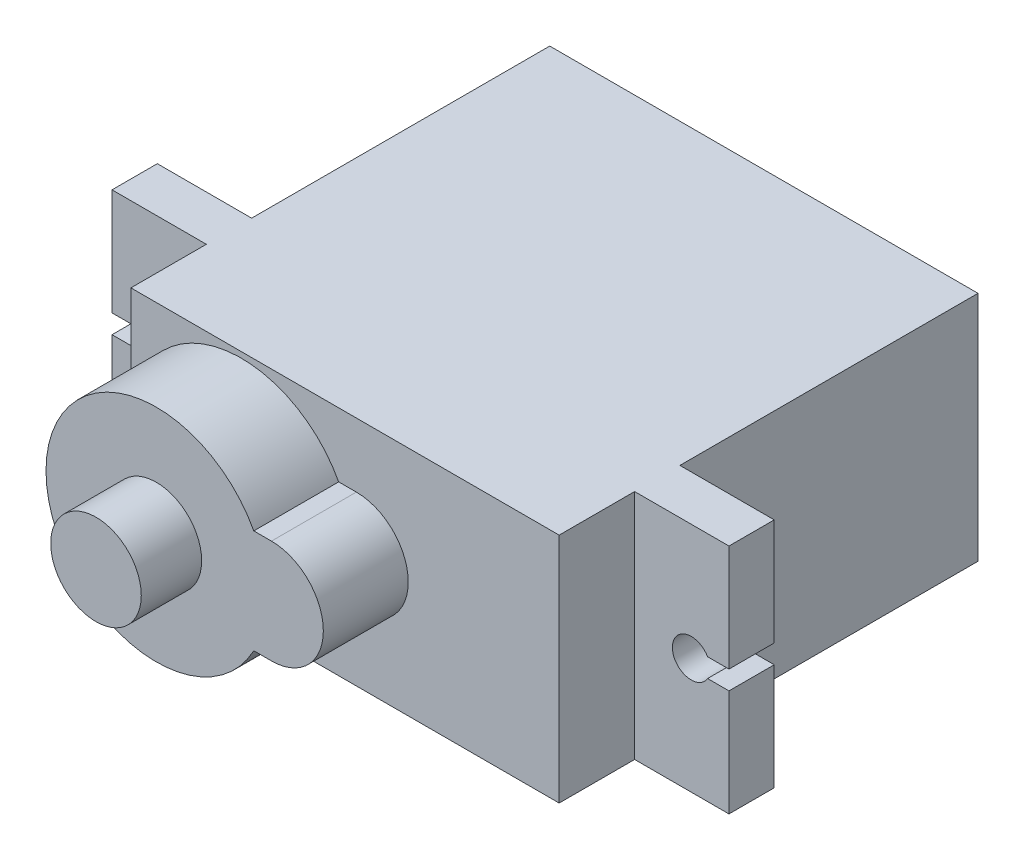
ISO-10303-21;
HEADER;
FILE_DESCRIPTION(('STEP AP214'),'2;1');
FILE_NAME('part.step','',(''),(''),'','','');
FILE_SCHEMA(('AUTOMOTIVE_DESIGN { 1 0 10303 214 1 1 1 1 }'));
ENDSEC;
DATA;
#1=APPLICATION_CONTEXT('core data for automotive mechanical design processes');
#2=APPLICATION_PROTOCOL_DEFINITION('international standard','automotive_design',2000,#1);
#3=PRODUCT_CONTEXT('',#1,'mechanical');
#4=PRODUCT('Part','Part','',(#3));
#5=PRODUCT_RELATED_PRODUCT_CATEGORY('part','',(#4));
#6=PRODUCT_DEFINITION_FORMATION('','',#4);
#7=PRODUCT_DEFINITION_CONTEXT('part definition',#1,'design');
#8=PRODUCT_DEFINITION('design','',#6,#7);
#9=PRODUCT_DEFINITION_SHAPE('','',#8);
#10=(LENGTH_UNIT() NAMED_UNIT(*) SI_UNIT(.MILLI.,.METRE.));
#11=(NAMED_UNIT(*) PLANE_ANGLE_UNIT() SI_UNIT($,.RADIAN.));
#12=(NAMED_UNIT(*) SI_UNIT($,.STERADIAN.) SOLID_ANGLE_UNIT());
#13=UNCERTAINTY_MEASURE_WITH_UNIT(LENGTH_MEASURE(1.E-05),#10,'distance_accuracy_value','');
#14=(GEOMETRIC_REPRESENTATION_CONTEXT(3) GLOBAL_UNCERTAINTY_ASSIGNED_CONTEXT((#13)) GLOBAL_UNIT_ASSIGNED_CONTEXT((#10,
#11,#12)) REPRESENTATION_CONTEXT('',''));
#15=CARTESIAN_POINT('',(0.,0.,0.));
#16=DIRECTION('',(0.,0.,1.));
#17=DIRECTION('',(1.,0.,0.));
#18=AXIS2_PLACEMENT_3D('',#15,#16,#17);
#19=CARTESIAN_POINT('',(-27.9208904109589,-0.27549019607844,22.2));
#20=DIRECTION('',(1.,0.,0.));
#21=DIRECTION('',(0.,0.,-1.));
#22=AXIS2_PLACEMENT_3D('',#19,#20,#21);
#23=PLANE('',#22);
#24=DIRECTION('',(0.,-1.,0.));
#25=VECTOR('',#24,1.);
#26=CARTESIAN_POINT('',(-27.9208904109589,-12.5754901960784,15.8));
#27=LINE('',#26,#25);
#28=CARTESIAN_POINT('',(-27.9208904109589,-0.27549019607844,15.8));
#29=VERTEX_POINT('',#28);
#30=CARTESIAN_POINT('',(-27.9208904109589,-5.92549019607844,15.8));
#31=VERTEX_POINT('',#30);
#32=EDGE_CURVE('E221',#29,#31,#27,.T.);
#33=ORIENTED_EDGE('',*,*,#32,.T.);
#34=DIRECTION('',(0.,0.,1.));
#35=VECTOR('',#34,1.);
#36=CARTESIAN_POINT('',(-27.9208904109589,-5.92549019607844,12.194448724536));
#37=LINE('',#36,#35);
#38=CARTESIAN_POINT('',(-27.9208904109589,-5.92549019607844,18.2));
#39=VERTEX_POINT('',#38);
#40=EDGE_CURVE('E205',#31,#39,#37,.T.);
#41=ORIENTED_EDGE('',*,*,#40,.T.);
#42=DIRECTION('',(0.,1.,0.));
#43=VECTOR('',#42,1.);
#44=CARTESIAN_POINT('',(-27.9208904109589,-12.5754901960784,18.2));
#45=LINE('',#44,#43);
#46=CARTESIAN_POINT('',(-27.9208904109589,-0.275490196078443,18.2));
#47=VERTEX_POINT('',#46);
#48=EDGE_CURVE('E230',#39,#47,#45,.T.);
#49=ORIENTED_EDGE('',*,*,#48,.T.);
#50=DIRECTION('',(0.,0.,-1.));
#51=VECTOR('',#50,1.);
#52=CARTESIAN_POINT('',(-27.9208904109589,-0.275490196078443,18.2));
#53=LINE('',#52,#51);
#54=EDGE_CURVE('E227',#47,#29,#53,.T.);
#55=ORIENTED_EDGE('',*,*,#54,.T.);
#56=EDGE_LOOP('',(#33,#41,#49,#55));
#57=FACE_BOUND('',#56,.T.);
#58=ADVANCED_FACE('F38',(#57),#23,.F.);
#59=CARTESIAN_POINT('',(4.77910958904109,0.,0.));
#60=DIRECTION('',(-1.,0.,0.));
#61=DIRECTION('',(0.,-1.,0.));
#62=AXIS2_PLACEMENT_3D('',#59,#60,#61);
#63=PLANE('',#62);
#64=DIRECTION('',(0.,1.,0.));
#65=VECTOR('',#64,1.);
#66=CARTESIAN_POINT('',(4.77910958904109,-12.5754901960784,15.8));
#67=LINE('',#66,#65);
#68=CARTESIAN_POINT('',(4.77910958904109,-12.5754901960784,15.8));
#69=VERTEX_POINT('',#68);
#70=CARTESIAN_POINT('',(4.77910958904109,-6.92549019607844,15.8));
#71=VERTEX_POINT('',#70);
#72=EDGE_CURVE('E326',#69,#71,#67,.T.);
#73=ORIENTED_EDGE('',*,*,#72,.T.);
#74=DIRECTION('',(0.,0.,1.));
#75=VECTOR('',#74,1.);
#76=CARTESIAN_POINT('',(4.77910958904109,-6.92549019607844,12.194448724536));
#77=LINE('',#76,#75);
#78=CARTESIAN_POINT('',(4.77910958904109,-6.92549019607844,18.2));
#79=VERTEX_POINT('',#78);
#80=EDGE_CURVE('E415',#71,#79,#77,.T.);
#81=ORIENTED_EDGE('',*,*,#80,.T.);
#82=DIRECTION('',(0.,-1.,0.));
#83=VECTOR('',#82,1.);
#84=CARTESIAN_POINT('',(4.77910958904109,-12.5754901960784,18.2));
#85=LINE('',#84,#83);
#86=CARTESIAN_POINT('',(4.77910958904109,-12.5754901960784,18.2));
#87=VERTEX_POINT('',#86);
#88=EDGE_CURVE('E335',#79,#87,#85,.T.);
#89=ORIENTED_EDGE('',*,*,#88,.T.);
#90=DIRECTION('',(0.,0.,-1.));
#91=VECTOR('',#90,1.);
#92=CARTESIAN_POINT('',(4.77910958904109,-12.5754901960784,18.2));
#93=LINE('',#92,#91);
#94=EDGE_CURVE('E330',#87,#69,#93,.T.);
#95=ORIENTED_EDGE('',*,*,#94,.T.);
#96=EDGE_LOOP('',(#73,#81,#89,#95));
#97=FACE_BOUND('',#96,.T.);
#98=ADVANCED_FACE('F332',(#97),#63,.F.);
#99=CARTESIAN_POINT('',(-22.9208904109589,-0.27549019607844,22.2));
#100=DIRECTION('',(1.,0.,0.));
#101=DIRECTION('',(0.,0.,-1.));
#102=AXIS2_PLACEMENT_3D('',#99,#100,#101);
#103=PLANE('',#102);
#104=DIRECTION('',(0.,0.,-1.));
#105=VECTOR('',#104,1.);
#106=CARTESIAN_POINT('',(-22.9208904109589,-0.27549019607844,22.2));
#107=LINE('',#106,#105);
#108=CARTESIAN_POINT('',(-22.9208904109589,-0.27549019607844,22.2));
#109=VERTEX_POINT('',#108);
#110=CARTESIAN_POINT('',(-22.9208904109589,-0.275490196078443,18.2));
#111=VERTEX_POINT('',#110);
#112=EDGE_CURVE('E288',#109,#111,#107,.T.);
#113=ORIENTED_EDGE('',*,*,#112,.T.);
#114=DIRECTION('',(0.,-1.,0.));
#115=VECTOR('',#114,1.);
#116=CARTESIAN_POINT('',(-22.9208904109589,-0.27549019607844,18.2));
#117=LINE('',#116,#115);
#118=CARTESIAN_POINT('',(-22.9208904109589,-12.5754901960784,18.2));
#119=VERTEX_POINT('',#118);
#120=EDGE_CURVE('E262',#111,#119,#117,.T.);
#121=ORIENTED_EDGE('',*,*,#120,.T.);
#122=DIRECTION('',(0.,0.,-1.));
#123=VECTOR('',#122,1.);
#124=CARTESIAN_POINT('',(-22.9208904109589,-12.5754901960784,22.2));
#125=LINE('',#124,#123);
#126=CARTESIAN_POINT('',(-22.9208904109589,-12.5754901960784,22.2));
#127=VERTEX_POINT('',#126);
#128=EDGE_CURVE('E42',#127,#119,#125,.T.);
#129=ORIENTED_EDGE('',*,*,#128,.F.);
#130=DIRECTION('',(0.,-1.,0.));
#131=VECTOR('',#130,1.);
#132=CARTESIAN_POINT('',(-22.9208904109589,-0.27549019607844,22.2));
#133=LINE('',#132,#131);
#134=CARTESIAN_POINT('',(-22.9208904109589,-6.42549019607844,22.2));
#135=VERTEX_POINT('',#134);
#136=EDGE_CURVE('E270',#135,#127,#133,.T.);
#137=ORIENTED_EDGE('',*,*,#136,.F.);
#138=EDGE_CURVE('E266',#109,#135,#133,.T.);
#139=ORIENTED_EDGE('',*,*,#138,.F.);
#140=EDGE_LOOP('',(#113,#121,#129,#137,#139));
#141=FACE_BOUND('',#140,.T.);
#142=ADVANCED_FACE('F362',(#141),#103,.F.);
#143=CARTESIAN_POINT('',(-0.220890410958909,-0.27549019607844,22.2));
#144=DIRECTION('',(-1.,0.,0.));
#145=DIRECTION('',(0.,-1.,0.));
#146=AXIS2_PLACEMENT_3D('',#143,#144,#145);
#147=PLANE('',#146);
#148=DIRECTION('',(0.,0.,-1.));
#149=VECTOR('',#148,1.);
#150=CARTESIAN_POINT('',(-0.220890410958907,-12.5754901960784,22.2));
#151=LINE('',#150,#149);
#152=CARTESIAN_POINT('',(-0.220890410958907,-12.5754901960784,22.2));
#153=VERTEX_POINT('',#152);
#154=CARTESIAN_POINT('',(-0.220890410958907,-12.5754901960784,18.2));
#155=VERTEX_POINT('',#154);
#156=EDGE_CURVE('E295',#153,#155,#151,.T.);
#157=ORIENTED_EDGE('',*,*,#156,.T.);
#158=DIRECTION('',(0.,1.,0.));
#159=VECTOR('',#158,1.);
#160=CARTESIAN_POINT('',(-0.220890410958909,-0.27549019607844,18.2));
#161=LINE('',#160,#159);
#162=CARTESIAN_POINT('',(-0.220890410958909,-0.27549019607844,18.2));
#163=VERTEX_POINT('',#162);
#164=EDGE_CURVE('E260',#155,#163,#161,.T.);
#165=ORIENTED_EDGE('',*,*,#164,.T.);
#166=DIRECTION('',(0.,0.,-1.));
#167=VECTOR('',#166,1.);
#168=CARTESIAN_POINT('',(-0.220890410958909,-0.27549019607844,22.2));
#169=LINE('',#168,#167);
#170=CARTESIAN_POINT('',(-0.220890410958909,-0.27549019607844,22.2));
#171=VERTEX_POINT('',#170);
#172=EDGE_CURVE('E292',#171,#163,#169,.T.);
#173=ORIENTED_EDGE('',*,*,#172,.F.);
#174=DIRECTION('',(0.,1.,0.));
#175=VECTOR('',#174,1.);
#176=CARTESIAN_POINT('',(-0.220890410958909,-0.27549019607844,22.2));
#177=LINE('',#176,#175);
#178=EDGE_CURVE('E272',#153,#171,#177,.T.);
#179=ORIENTED_EDGE('',*,*,#178,.F.);
#180=EDGE_LOOP('',(#157,#165,#173,#179));
#181=FACE_BOUND('',#180,.T.);
#182=ADVANCED_FACE('F354',(#181),#147,.F.);
#183=CARTESIAN_POINT('',(-22.9208904109589,-7.93549019607844,4.75));
#184=DIRECTION('',(1.,0.,0.));
#185=DIRECTION('',(0.,0.,-1.));
#186=AXIS2_PLACEMENT_3D('',#183,#184,#185);
#187=CIRCLE('',#186,0.749999999999999);
#188=CARTESIAN_POINT('',(-22.9208904109589,-7.93549019607844,4.));
#189=VERTEX_POINT('',#188);
#190=EDGE_CURVE('E459',#189,#189,#187,.T.);
#191=ORIENTED_EDGE('',*,*,#190,.T.);
#192=EDGE_LOOP('',(#191));
#193=FACE_BOUND('',#192,.T.);
#194=CARTESIAN_POINT('',(-22.9208904109589,-4.91549019607844,4.75));
#195=DIRECTION('',(1.,0.,0.));
#196=DIRECTION('',(0.,0.,-1.));
#197=AXIS2_PLACEMENT_3D('',#194,#195,#196);
#198=CIRCLE('',#197,0.749999999999999);
#199=CARTESIAN_POINT('',(-22.9208904109589,-4.91549019607844,4.));
#200=VERTEX_POINT('',#199);
#201=EDGE_CURVE('E453',#200,#200,#198,.T.);
#202=ORIENTED_EDGE('',*,*,#201,.T.);
#203=EDGE_LOOP('',(#202));
#204=FACE_BOUND('',#203,.T.);
#205=CARTESIAN_POINT('',(-22.9208904109589,-6.42549019607844,4.75));
#206=DIRECTION('',(1.,0.,0.));
#207=DIRECTION('',(0.,0.,-1.));
#208=AXIS2_PLACEMENT_3D('',#205,#206,#207);
#209=CIRCLE('',#208,0.749999999999999);
#210=CARTESIAN_POINT('',(-22.9208904109589,-6.42549019607844,4.));
#211=VERTEX_POINT('',#210);
#212=EDGE_CURVE('E444',#211,#211,#209,.T.);
#213=ORIENTED_EDGE('',*,*,#212,.T.);
#214=EDGE_LOOP('',(#213));
#215=FACE_BOUND('',#214,.T.);
#216=CARTESIAN_POINT('',(-22.9208904109589,-12.5754901960784,15.8));
#217=VERTEX_POINT('',#216);
#218=CARTESIAN_POINT('',(-22.9208904109589,-12.5754901960784,0.));
#219=VERTEX_POINT('',#218);
#220=EDGE_CURVE('E296',#217,#219,#125,.T.);
#221=ORIENTED_EDGE('',*,*,#220,.F.);
#222=DIRECTION('',(0.,1.,0.));
#223=VECTOR('',#222,1.);
#224=CARTESIAN_POINT('',(-22.9208904109589,-0.27549019607844,15.8));
#225=LINE('',#224,#223);
#226=CARTESIAN_POINT('',(-22.9208904109589,-0.275490196078443,15.8));
#227=VERTEX_POINT('',#226);
#228=EDGE_CURVE('E257',#217,#227,#225,.T.);
#229=ORIENTED_EDGE('',*,*,#228,.T.);
#230=CARTESIAN_POINT('',(-22.9208904109589,-0.27549019607844,0.));
#231=VERTEX_POINT('',#230);
#232=EDGE_CURVE('E276',#227,#231,#107,.T.);
#233=ORIENTED_EDGE('',*,*,#232,.T.);
#234=DIRECTION('',(0.,-1.,0.));
#235=VECTOR('',#234,1.);
#236=CARTESIAN_POINT('',(-22.9208904109589,-0.27549019607844,0.));
#237=LINE('',#236,#235);
#238=EDGE_CURVE('E265',#231,#219,#237,.T.);
#239=ORIENTED_EDGE('',*,*,#238,.T.);
#240=EDGE_LOOP('',(#221,#229,#233,#239));
#241=FACE_BOUND('',#240,.T.);
#242=ADVANCED_FACE('F40',(#193,#204,#215,#241),#103,.F.);
#243=CARTESIAN_POINT('',(-22.9208904109589,-12.5754901960784,22.2));
#244=DIRECTION('',(0.,1.,0.));
#245=DIRECTION('',(0.,0.,1.));
#246=AXIS2_PLACEMENT_3D('',#243,#244,#245);
#247=PLANE('',#246);
#248=CARTESIAN_POINT('',(-0.220890410958921,-12.5754901960784,15.8));
#249=VERTEX_POINT('',#248);
#250=CARTESIAN_POINT('',(-0.220890410958907,-12.5754901960784,0.));
#251=VERTEX_POINT('',#250);
#252=EDGE_CURVE('E294',#249,#251,#151,.T.);
#253=ORIENTED_EDGE('',*,*,#252,.F.);
#254=DIRECTION('',(1.,0.,0.));
#255=VECTOR('',#254,1.);
#256=CARTESIAN_POINT('',(-45.4528495554822,-12.5754901960784,15.8));
#257=LINE('',#256,#255);
#258=EDGE_CURVE('E249',#249,#69,#257,.T.);
#259=ORIENTED_EDGE('',*,*,#258,.T.);
#260=ORIENTED_EDGE('',*,*,#94,.F.);
#261=DIRECTION('',(1.,0.,0.));
#262=VECTOR('',#261,1.);
#263=CARTESIAN_POINT('',(-45.4528495554822,-12.5754901960784,18.2));
#264=LINE('',#263,#262);
#265=EDGE_CURVE('E252',#155,#87,#264,.T.);
#266=ORIENTED_EDGE('',*,*,#265,.F.);
#267=ORIENTED_EDGE('',*,*,#156,.F.);
#268=DIRECTION('',(1.,0.,0.));
#269=VECTOR('',#268,1.);
#270=CARTESIAN_POINT('',(-22.9208904109589,-12.5754901960784,22.2));
#271=LINE('',#270,#269);
#272=EDGE_CURVE('E269',#127,#153,#271,.T.);
#273=ORIENTED_EDGE('',*,*,#272,.F.);
#274=ORIENTED_EDGE('',*,*,#128,.T.);
#275=CARTESIAN_POINT('',(-27.9208904109589,-12.5754901960784,18.2));
#276=VERTEX_POINT('',#275);
#277=EDGE_CURVE('E250',#276,#119,#264,.T.);
#278=ORIENTED_EDGE('',*,*,#277,.F.);
#279=DIRECTION('',(0.,0.,1.));
#280=VECTOR('',#279,1.);
#281=CARTESIAN_POINT('',(-27.9208904109589,-12.5754901960784,18.2));
#282=LINE('',#281,#280);
#283=CARTESIAN_POINT('',(-27.9208904109589,-12.5754901960784,15.8));
#284=VERTEX_POINT('',#283);
#285=EDGE_CURVE('E240',#284,#276,#282,.T.);
#286=ORIENTED_EDGE('',*,*,#285,.F.);
#287=EDGE_CURVE('E247',#284,#217,#257,.T.);
#288=ORIENTED_EDGE('',*,*,#287,.T.);
#289=ORIENTED_EDGE('',*,*,#220,.T.);
#290=DIRECTION('',(1.,0.,0.));
#291=VECTOR('',#290,1.);
#292=CARTESIAN_POINT('',(-22.9208904109589,-12.5754901960784,0.));
#293=LINE('',#292,#291);
#294=EDGE_CURVE('E279',#219,#251,#293,.T.);
#295=ORIENTED_EDGE('',*,*,#294,.T.);
#296=EDGE_LOOP('',(#253,#259,#260,#266,#267,#273,#274,#278,#286,#288,#289,#295));
#297=FACE_BOUND('',#296,.T.);
#298=ADVANCED_FACE('F309',(#297),#247,.F.);
#299=CARTESIAN_POINT('',(-0.220890410958909,-0.27549019607844,15.8));
#300=VERTEX_POINT('',#299);
#301=CARTESIAN_POINT('',(-0.220890410958909,-0.27549019607844,0.));
#302=VERTEX_POINT('',#301);
#303=EDGE_CURVE('E291',#300,#302,#169,.T.);
#304=ORIENTED_EDGE('',*,*,#303,.F.);
#305=DIRECTION('',(0.,-1.,0.));
#306=VECTOR('',#305,1.);
#307=CARTESIAN_POINT('',(-0.220890410958909,-0.27549019607844,15.8));
#308=LINE('',#307,#306);
#309=EDGE_CURVE('E254',#300,#249,#308,.T.);
#310=ORIENTED_EDGE('',*,*,#309,.T.);
#311=ORIENTED_EDGE('',*,*,#252,.T.);
#312=DIRECTION('',(0.,1.,0.));
#313=VECTOR('',#312,1.);
#314=CARTESIAN_POINT('',(-0.220890410958909,-0.27549019607844,0.));
#315=LINE('',#314,#313);
#316=EDGE_CURVE('E282',#251,#302,#315,.T.);
#317=ORIENTED_EDGE('',*,*,#316,.T.);
#318=EDGE_LOOP('',(#304,#310,#311,#317));
#319=FACE_BOUND('',#318,.T.);
#320=ADVANCED_FACE('F302',(#319),#147,.F.);
#321=CARTESIAN_POINT('',(-22.9208904109589,-0.27549019607844,22.2));
#322=DIRECTION('',(0.,-1.,0.));
#323=DIRECTION('',(0.,0.,-1.));
#324=AXIS2_PLACEMENT_3D('',#321,#322,#323);
#325=PLANE('',#324);
#326=ORIENTED_EDGE('',*,*,#232,.F.);
#327=DIRECTION('',(1.,0.,0.));
#328=VECTOR('',#327,1.);
#329=CARTESIAN_POINT('',(-45.4528495554822,-0.275490196078445,15.8));
#330=LINE('',#329,#328);
#331=EDGE_CURVE('E244',#29,#227,#330,.T.);
#332=ORIENTED_EDGE('',*,*,#331,.F.);
#333=ORIENTED_EDGE('',*,*,#54,.F.);
#334=DIRECTION('',(1.,0.,0.));
#335=VECTOR('',#334,1.);
#336=CARTESIAN_POINT('',(-45.4528495554822,-0.275490196078445,18.2));
#337=LINE('',#336,#335);
#338=EDGE_CURVE('E232',#47,#111,#337,.T.);
#339=ORIENTED_EDGE('',*,*,#338,.T.);
#340=ORIENTED_EDGE('',*,*,#112,.F.);
#341=DIRECTION('',(-1.,0.,0.));
#342=VECTOR('',#341,1.);
#343=CARTESIAN_POINT('',(-22.9208904109589,-0.27549019607844,22.2));
#344=LINE('',#343,#342);
#345=EDGE_CURVE('E274',#171,#109,#344,.T.);
#346=ORIENTED_EDGE('',*,*,#345,.F.);
#347=ORIENTED_EDGE('',*,*,#172,.T.);
#348=CARTESIAN_POINT('',(4.77910958904109,-0.275490196078439,18.2));
#349=VERTEX_POINT('',#348);
#350=EDGE_CURVE('E243',#163,#349,#337,.T.);
#351=ORIENTED_EDGE('',*,*,#350,.T.);
#352=DIRECTION('',(0.,0.,1.));
#353=VECTOR('',#352,1.);
#354=CARTESIAN_POINT('',(4.77910958904109,-0.275490196078439,18.2));
#355=LINE('',#354,#353);
#356=CARTESIAN_POINT('',(4.77910958904109,-0.275490196078439,15.8));
#357=VERTEX_POINT('',#356);
#358=EDGE_CURVE('E234',#357,#349,#355,.T.);
#359=ORIENTED_EDGE('',*,*,#358,.F.);
#360=EDGE_CURVE('E246',#300,#357,#330,.T.);
#361=ORIENTED_EDGE('',*,*,#360,.F.);
#362=ORIENTED_EDGE('',*,*,#303,.T.);
#363=DIRECTION('',(-1.,0.,0.));
#364=VECTOR('',#363,1.);
#365=CARTESIAN_POINT('',(-22.9208904109589,-0.27549019607844,0.));
#366=LINE('',#365,#364);
#367=EDGE_CURVE('E285',#302,#231,#366,.T.);
#368=ORIENTED_EDGE('',*,*,#367,.T.);
#369=EDGE_LOOP('',(#326,#332,#333,#339,#340,#346,#347,#351,#359,#361,#362,#368));
#370=FACE_BOUND('',#369,.T.);
#371=ADVANCED_FACE('F316',(#370),#325,.F.);
#372=CARTESIAN_POINT('',(0.,0.,22.2));
#373=DIRECTION('',(0.,0.,1.));
#374=DIRECTION('',(1.,0.,0.));
#375=AXIS2_PLACEMENT_3D('',#372,#373,#374);
#376=PLANE('',#375);
#377=DIRECTION('',(1.,0.,0.));
#378=VECTOR('',#377,1.);
#379=CARTESIAN_POINT('',(-10.9708904109589,-9.17549019607844,22.2));
#380=LINE('',#379,#378);
#381=CARTESIAN_POINT('',(-11.9075581535887,-9.17549019607844,22.2));
#382=VERTEX_POINT('',#381);
#383=CARTESIAN_POINT('',(-10.9708904109589,-9.17549019607844,22.2));
#384=VERTEX_POINT('',#383);
#385=EDGE_CURVE('E373',#382,#384,#380,.T.);
#386=ORIENTED_EDGE('',*,*,#385,.F.);
#387=CARTESIAN_POINT('',(-17.0708904109589,-6.42549019607844,22.2));
#388=DIRECTION('',(0.,0.,1.));
#389=DIRECTION('',(1.,0.,0.));
#390=AXIS2_PLACEMENT_3D('',#387,#388,#389);
#391=CIRCLE('',#390,5.85);
#392=EDGE_CURVE('E12',#135,#382,#391,.T.);
#393=ORIENTED_EDGE('',*,*,#392,.F.);
#394=ORIENTED_EDGE('',*,*,#136,.T.);
#395=ORIENTED_EDGE('',*,*,#272,.T.);
#396=ORIENTED_EDGE('',*,*,#178,.T.);
#397=ORIENTED_EDGE('',*,*,#345,.T.);
#398=ORIENTED_EDGE('',*,*,#138,.T.);
#399=CARTESIAN_POINT('',(-11.9075581535887,-3.67549019607844,22.2));
#400=VERTEX_POINT('',#399);
#401=EDGE_CURVE('E48',#400,#135,#391,.T.);
#402=ORIENTED_EDGE('',*,*,#401,.F.);
#403=DIRECTION('',(-1.,0.,0.));
#404=VECTOR('',#403,1.);
#405=CARTESIAN_POINT('',(-10.9708904109589,-3.67549019607844,22.2));
#406=LINE('',#405,#404);
#407=CARTESIAN_POINT('',(-10.9708904109589,-3.67549019607844,22.2));
#408=VERTEX_POINT('',#407);
#409=EDGE_CURVE('E374',#408,#400,#406,.T.);
#410=ORIENTED_EDGE('',*,*,#409,.F.);
#411=CARTESIAN_POINT('',(-10.9708904109589,-6.42549019607844,22.2));
#412=DIRECTION('',(0.,0.,1.));
#413=DIRECTION('',(1.,0.,0.));
#414=AXIS2_PLACEMENT_3D('',#411,#412,#413);
#415=CIRCLE('',#414,2.75);
#416=EDGE_CURVE('E378',#384,#408,#415,.T.);
#417=ORIENTED_EDGE('',*,*,#416,.F.);
#418=EDGE_LOOP('',(#386,#393,#394,#395,#396,#397,#398,#402,#410,#417));
#419=FACE_BOUND('',#418,.T.);
#420=ADVANCED_FACE('F357',(#419),#376,.T.);
#421=CARTESIAN_POINT('',(0.,0.,0.));
#422=DIRECTION('',(0.,0.,1.));
#423=DIRECTION('',(1.,0.,0.));
#424=AXIS2_PLACEMENT_3D('',#421,#422,#423);
#425=PLANE('',#424);
#426=ORIENTED_EDGE('',*,*,#238,.F.);
#427=ORIENTED_EDGE('',*,*,#367,.F.);
#428=ORIENTED_EDGE('',*,*,#316,.F.);
#429=ORIENTED_EDGE('',*,*,#294,.F.);
#430=EDGE_LOOP('',(#426,#427,#428,#429));
#431=FACE_BOUND('',#430,.T.);
#432=ADVANCED_FACE('F313',(#431),#425,.F.);
#433=CARTESIAN_POINT('',(4.77910958904109,-5.92549019607844,18.2));
#434=VERTEX_POINT('',#433);
#435=EDGE_CURVE('E338',#349,#434,#85,.T.);
#436=ORIENTED_EDGE('',*,*,#435,.T.);
#437=DIRECTION('',(0.,0.,1.));
#438=VECTOR('',#437,1.);
#439=CARTESIAN_POINT('',(4.77910958904109,-5.92549019607844,12.194448724536));
#440=LINE('',#439,#438);
#441=CARTESIAN_POINT('',(4.77910958904109,-5.92549019607844,15.8));
#442=VERTEX_POINT('',#441);
#443=EDGE_CURVE('E417',#442,#434,#440,.T.);
#444=ORIENTED_EDGE('',*,*,#443,.F.);
#445=EDGE_CURVE('E337',#442,#357,#67,.T.);
#446=ORIENTED_EDGE('',*,*,#445,.T.);
#447=ORIENTED_EDGE('',*,*,#358,.T.);
#448=EDGE_LOOP('',(#436,#444,#446,#447));
#449=FACE_BOUND('',#448,.T.);
#450=ADVANCED_FACE('F514',(#449),#63,.F.);
#451=CARTESIAN_POINT('',(-45.4528495554822,-12.5754901960784,15.8));
#452=DIRECTION('',(0.,0.,-1.));
#453=DIRECTION('',(-1.,0.,0.));
#454=AXIS2_PLACEMENT_3D('',#451,#452,#453);
#455=PLANE('',#454);
#456=DIRECTION('',(1.,0.,0.));
#457=VECTOR('',#456,1.);
#458=CARTESIAN_POINT('',(4.77910958904109,-6.92549019607844,15.8));
#459=LINE('',#458,#457);
#460=CARTESIAN_POINT('',(3.64513499282553,-6.92549019607844,15.8));
#461=VERTEX_POINT('',#460);
#462=EDGE_CURVE('E418',#461,#71,#459,.T.);
#463=ORIENTED_EDGE('',*,*,#462,.T.);
#464=ORIENTED_EDGE('',*,*,#72,.F.);
#465=ORIENTED_EDGE('',*,*,#258,.F.);
#466=ORIENTED_EDGE('',*,*,#309,.F.);
#467=ORIENTED_EDGE('',*,*,#360,.T.);
#468=ORIENTED_EDGE('',*,*,#445,.F.);
#469=DIRECTION('',(-1.,0.,0.));
#470=VECTOR('',#469,1.);
#471=CARTESIAN_POINT('',(4.77910958904109,-5.92549019607844,15.8));
#472=LINE('',#471,#470);
#473=CARTESIAN_POINT('',(3.64513499282553,-5.92549019607844,15.8));
#474=VERTEX_POINT('',#473);
#475=EDGE_CURVE('E420',#442,#474,#472,.T.);
#476=ORIENTED_EDGE('',*,*,#475,.T.);
#477=CARTESIAN_POINT('',(2.77910958904109,-6.42549019607844,15.8));
#478=DIRECTION('',(0.,0.,-1.));
#479=DIRECTION('',(-1.,0.,0.));
#480=AXIS2_PLACEMENT_3D('',#477,#478,#479);
#481=CIRCLE('',#480,1.);
#482=EDGE_CURVE('E414',#474,#461,#481,.F.);
#483=ORIENTED_EDGE('',*,*,#482,.T.);
#484=EDGE_LOOP('',(#463,#464,#465,#466,#467,#468,#476,#483));
#485=FACE_BOUND('',#484,.T.);
#486=ADVANCED_FACE('F322',(#485),#455,.T.);
#487=CARTESIAN_POINT('',(-45.4528495554822,-12.5754901960784,18.2));
#488=DIRECTION('',(0.,0.,1.));
#489=DIRECTION('',(1.,0.,0.));
#490=AXIS2_PLACEMENT_3D('',#487,#488,#489);
#491=PLANE('',#490);
#492=DIRECTION('',(1.,0.,0.));
#493=VECTOR('',#492,1.);
#494=CARTESIAN_POINT('',(4.77910958904109,-6.92549019607844,18.2));
#495=LINE('',#494,#493);
#496=CARTESIAN_POINT('',(3.64513499282553,-6.92549019607844,18.2));
#497=VERTEX_POINT('',#496);
#498=EDGE_CURVE('E431',#497,#79,#495,.T.);
#499=ORIENTED_EDGE('',*,*,#498,.F.);
#500=CARTESIAN_POINT('',(2.77910958904109,-6.42549019607844,18.2));
#501=DIRECTION('',(0.,0.,1.));
#502=DIRECTION('',(1.,0.,0.));
#503=AXIS2_PLACEMENT_3D('',#500,#501,#502);
#504=CIRCLE('',#503,1.);
#505=CARTESIAN_POINT('',(3.64513499282553,-5.92549019607844,18.2));
#506=VERTEX_POINT('',#505);
#507=EDGE_CURVE('E428',#506,#497,#504,.T.);
#508=ORIENTED_EDGE('',*,*,#507,.F.);
#509=DIRECTION('',(-1.,0.,0.));
#510=VECTOR('',#509,1.);
#511=CARTESIAN_POINT('',(4.77910958904109,-5.92549019607844,18.2));
#512=LINE('',#511,#510);
#513=EDGE_CURVE('E63',#434,#506,#512,.T.);
#514=ORIENTED_EDGE('',*,*,#513,.F.);
#515=ORIENTED_EDGE('',*,*,#435,.F.);
#516=ORIENTED_EDGE('',*,*,#350,.F.);
#517=ORIENTED_EDGE('',*,*,#164,.F.);
#518=ORIENTED_EDGE('',*,*,#265,.T.);
#519=ORIENTED_EDGE('',*,*,#88,.F.);
#520=EDGE_LOOP('',(#499,#508,#514,#515,#516,#517,#518,#519));
#521=FACE_BOUND('',#520,.T.);
#522=ADVANCED_FACE('F348',(#521),#491,.T.);
#523=DIRECTION('',(-1.,0.,0.));
#524=VECTOR('',#523,1.);
#525=CARTESIAN_POINT('',(-27.9208904109589,-5.92549019607844,18.2));
#526=LINE('',#525,#524);
#527=CARTESIAN_POINT('',(-26.7869158147434,-5.92549019607844,18.2));
#528=VERTEX_POINT('',#527);
#529=EDGE_CURVE('E211',#528,#39,#526,.T.);
#530=ORIENTED_EDGE('',*,*,#529,.F.);
#531=CARTESIAN_POINT('',(-25.9208904109589,-6.42549019607843,18.2));
#532=DIRECTION('',(0.,0.,1.));
#533=DIRECTION('',(1.,0.,0.));
#534=AXIS2_PLACEMENT_3D('',#531,#532,#533);
#535=CIRCLE('',#534,1.00000000000001);
#536=CARTESIAN_POINT('',(-26.7869158147434,-6.92549019607845,18.2));
#537=VERTEX_POINT('',#536);
#538=EDGE_CURVE('E441',#537,#528,#535,.T.);
#539=ORIENTED_EDGE('',*,*,#538,.F.);
#540=DIRECTION('',(1.,0.,0.));
#541=VECTOR('',#540,1.);
#542=CARTESIAN_POINT('',(-27.9208904109589,-6.92549019607845,18.2));
#543=LINE('',#542,#541);
#544=CARTESIAN_POINT('',(-27.9208904109589,-6.92549019607845,18.2));
#545=VERTEX_POINT('',#544);
#546=EDGE_CURVE('E224',#545,#537,#543,.T.);
#547=ORIENTED_EDGE('',*,*,#546,.F.);
#548=EDGE_CURVE('E237',#276,#545,#45,.T.);
#549=ORIENTED_EDGE('',*,*,#548,.F.);
#550=ORIENTED_EDGE('',*,*,#277,.T.);
#551=ORIENTED_EDGE('',*,*,#120,.F.);
#552=ORIENTED_EDGE('',*,*,#338,.F.);
#553=ORIENTED_EDGE('',*,*,#48,.F.);
#554=EDGE_LOOP('',(#530,#539,#547,#549,#550,#551,#552,#553));
#555=FACE_BOUND('',#554,.T.);
#556=ADVANCED_FACE('F487',(#555),#491,.T.);
#557=DIRECTION('',(-1.,0.,0.));
#558=VECTOR('',#557,1.);
#559=CARTESIAN_POINT('',(-27.9208904109589,-5.92549019607844,15.8));
#560=LINE('',#559,#558);
#561=CARTESIAN_POINT('',(-26.7869158147434,-5.92549019607844,15.8));
#562=VERTEX_POINT('',#561);
#563=EDGE_CURVE('E208',#562,#31,#560,.T.);
#564=ORIENTED_EDGE('',*,*,#563,.T.);
#565=ORIENTED_EDGE('',*,*,#32,.F.);
#566=ORIENTED_EDGE('',*,*,#331,.T.);
#567=ORIENTED_EDGE('',*,*,#228,.F.);
#568=ORIENTED_EDGE('',*,*,#287,.F.);
#569=CARTESIAN_POINT('',(-27.9208904109589,-6.92549019607845,15.8));
#570=VERTEX_POINT('',#569);
#571=EDGE_CURVE('E228',#570,#284,#27,.T.);
#572=ORIENTED_EDGE('',*,*,#571,.F.);
#573=DIRECTION('',(1.,0.,0.));
#574=VECTOR('',#573,1.);
#575=CARTESIAN_POINT('',(-27.9208904109589,-6.92549019607845,15.8));
#576=LINE('',#575,#574);
#577=CARTESIAN_POINT('',(-26.7869158147434,-6.92549019607845,15.8));
#578=VERTEX_POINT('',#577);
#579=EDGE_CURVE('E55',#570,#578,#576,.T.);
#580=ORIENTED_EDGE('',*,*,#579,.T.);
#581=CARTESIAN_POINT('',(-25.9208904109589,-6.42549019607843,15.8));
#582=DIRECTION('',(0.,0.,-1.));
#583=DIRECTION('',(-1.,0.,0.));
#584=AXIS2_PLACEMENT_3D('',#581,#582,#583);
#585=CIRCLE('',#584,1.00000000000001);
#586=EDGE_CURVE('E223',#578,#562,#585,.F.);
#587=ORIENTED_EDGE('',*,*,#586,.T.);
#588=EDGE_LOOP('',(#564,#565,#566,#567,#568,#572,#580,#587));
#589=FACE_BOUND('',#588,.T.);
#590=ADVANCED_FACE('F220',(#589),#455,.T.);
#591=ORIENTED_EDGE('',*,*,#548,.T.);
#592=DIRECTION('',(0.,0.,1.));
#593=VECTOR('',#592,1.);
#594=CARTESIAN_POINT('',(-27.9208904109589,-6.92549019607845,12.194448724536));
#595=LINE('',#594,#593);
#596=EDGE_CURVE('E215',#570,#545,#595,.T.);
#597=ORIENTED_EDGE('',*,*,#596,.F.);
#598=ORIENTED_EDGE('',*,*,#571,.T.);
#599=ORIENTED_EDGE('',*,*,#285,.T.);
#600=EDGE_LOOP('',(#591,#597,#598,#599));
#601=FACE_BOUND('',#600,.T.);
#602=ADVANCED_FACE('F491',(#601),#23,.F.);
#603=CARTESIAN_POINT('',(-10.9708904109589,-6.42549019607844,26.7));
#604=DIRECTION('',(0.,0.,-1.));
#605=DIRECTION('',(-1.,0.,0.));
#606=AXIS2_PLACEMENT_3D('',#603,#604,#605);
#607=CYLINDRICAL_SURFACE('',#606,2.75);
#608=ORIENTED_EDGE('',*,*,#416,.T.);
#609=DIRECTION('',(0.,0.,-1.));
#610=VECTOR('',#609,1.);
#611=CARTESIAN_POINT('',(-10.9708904109589,-3.67549019607844,26.7));
#612=LINE('',#611,#610);
#613=CARTESIAN_POINT('',(-10.9708904109589,-3.67549019607844,26.7));
#614=VERTEX_POINT('',#613);
#615=EDGE_CURVE('E388',#614,#408,#612,.T.);
#616=ORIENTED_EDGE('',*,*,#615,.F.);
#617=CARTESIAN_POINT('',(-10.9708904109589,-6.42549019607844,26.7));
#618=DIRECTION('',(0.,0.,1.));
#619=DIRECTION('',(1.,0.,0.));
#620=AXIS2_PLACEMENT_3D('',#617,#618,#619);
#621=CIRCLE('',#620,2.75);
#622=CARTESIAN_POINT('',(-10.9708904109589,-9.17549019607844,26.7));
#623=VERTEX_POINT('',#622);
#624=EDGE_CURVE('E376',#623,#614,#621,.T.);
#625=ORIENTED_EDGE('',*,*,#624,.F.);
#626=DIRECTION('',(0.,0.,-1.));
#627=VECTOR('',#626,1.);
#628=CARTESIAN_POINT('',(-10.9708904109589,-9.17549019607844,26.7));
#629=LINE('',#628,#627);
#630=EDGE_CURVE('E382',#623,#384,#629,.T.);
#631=ORIENTED_EDGE('',*,*,#630,.T.);
#632=EDGE_LOOP('',(#608,#616,#625,#631));
#633=FACE_BOUND('',#632,.T.);
#634=ADVANCED_FACE('F398',(#633),#607,.T.);
#635=CARTESIAN_POINT('',(-10.9708904109589,-3.67549019607844,26.7));
#636=DIRECTION('',(0.,-1.,0.));
#637=DIRECTION('',(1.,0.,0.));
#638=AXIS2_PLACEMENT_3D('',#635,#636,#637);
#639=PLANE('',#638);
#640=ORIENTED_EDGE('',*,*,#409,.T.);
#641=DIRECTION('',(0.,0.,-1.));
#642=VECTOR('',#641,1.);
#643=CARTESIAN_POINT('',(-11.9075581535887,-3.67549019607844,26.7));
#644=LINE('',#643,#642);
#645=CARTESIAN_POINT('',(-11.9075581535887,-3.67549019607844,26.7));
#646=VERTEX_POINT('',#645);
#647=EDGE_CURVE('E372',#646,#400,#644,.T.);
#648=ORIENTED_EDGE('',*,*,#647,.F.);
#649=DIRECTION('',(-1.,0.,0.));
#650=VECTOR('',#649,1.);
#651=CARTESIAN_POINT('',(-10.9708904109589,-3.67549019607844,26.7));
#652=LINE('',#651,#650);
#653=EDGE_CURVE('E394',#614,#646,#652,.T.);
#654=ORIENTED_EDGE('',*,*,#653,.F.);
#655=ORIENTED_EDGE('',*,*,#615,.T.);
#656=EDGE_LOOP('',(#640,#648,#654,#655));
#657=FACE_BOUND('',#656,.T.);
#658=ADVANCED_FACE('F393',(#657),#639,.F.);
#659=CARTESIAN_POINT('',(-17.0708904109589,-6.42549019607844,26.7));
#660=DIRECTION('',(0.,0.,-1.));
#661=DIRECTION('',(-1.,0.,0.));
#662=AXIS2_PLACEMENT_3D('',#659,#660,#661);
#663=CYLINDRICAL_SURFACE('',#662,5.85);
#664=ORIENTED_EDGE('',*,*,#401,.T.);
#665=ORIENTED_EDGE('',*,*,#392,.T.);
#666=DIRECTION('',(0.,0.,-1.));
#667=VECTOR('',#666,1.);
#668=CARTESIAN_POINT('',(-11.9075581535887,-9.17549019607844,26.7));
#669=LINE('',#668,#667);
#670=CARTESIAN_POINT('',(-11.9075581535887,-9.17549019607844,26.7));
#671=VERTEX_POINT('',#670);
#672=EDGE_CURVE('E385',#671,#382,#669,.T.);
#673=ORIENTED_EDGE('',*,*,#672,.F.);
#674=CARTESIAN_POINT('',(-17.0708904109589,-6.42549019607844,26.7));
#675=DIRECTION('',(0.,0.,1.));
#676=DIRECTION('',(1.,0.,0.));
#677=AXIS2_PLACEMENT_3D('',#674,#675,#676);
#678=CIRCLE('',#677,5.85);
#679=EDGE_CURVE('E406',#646,#671,#678,.T.);
#680=ORIENTED_EDGE('',*,*,#679,.F.);
#681=ORIENTED_EDGE('',*,*,#647,.T.);
#682=EDGE_LOOP('',(#664,#665,#673,#680,#681));
#683=FACE_BOUND('',#682,.T.);
#684=ADVANCED_FACE('F367',(#683),#663,.T.);
#685=CARTESIAN_POINT('',(-10.9708904109589,-9.17549019607844,26.7));
#686=DIRECTION('',(0.,1.,0.));
#687=DIRECTION('',(-1.,0.,0.));
#688=AXIS2_PLACEMENT_3D('',#685,#686,#687);
#689=PLANE('',#688);
#690=ORIENTED_EDGE('',*,*,#385,.T.);
#691=ORIENTED_EDGE('',*,*,#630,.F.);
#692=DIRECTION('',(1.,0.,0.));
#693=VECTOR('',#692,1.);
#694=CARTESIAN_POINT('',(-10.9708904109589,-9.17549019607844,26.7));
#695=LINE('',#694,#693);
#696=EDGE_CURVE('E386',#671,#623,#695,.T.);
#697=ORIENTED_EDGE('',*,*,#696,.F.);
#698=ORIENTED_EDGE('',*,*,#672,.T.);
#699=EDGE_LOOP('',(#690,#691,#697,#698));
#700=FACE_BOUND('',#699,.T.);
#701=ADVANCED_FACE('F540',(#700),#689,.F.);
#702=CARTESIAN_POINT('',(-10.9708904109589,-6.42549019607844,26.7));
#703=DIRECTION('',(0.,0.,1.));
#704=DIRECTION('',(1.,0.,0.));
#705=AXIS2_PLACEMENT_3D('',#702,#703,#704);
#706=PLANE('',#705);
#707=CARTESIAN_POINT('',(-17.0708904109589,-6.42549019607844,26.7));
#708=DIRECTION('',(0.,0.,1.));
#709=DIRECTION('',(1.,0.,0.));
#710=AXIS2_PLACEMENT_3D('',#707,#708,#709);
#711=CIRCLE('',#710,2.4);
#712=CARTESIAN_POINT('',(-14.6708904109589,-6.42549019607844,26.7));
#713=VERTEX_POINT('',#712);
#714=EDGE_CURVE('E402',#713,#713,#711,.T.);
#715=ORIENTED_EDGE('',*,*,#714,.F.);
#716=EDGE_LOOP('',(#715));
#717=FACE_BOUND('',#716,.T.);
#718=ORIENTED_EDGE('',*,*,#624,.T.);
#719=ORIENTED_EDGE('',*,*,#653,.T.);
#720=ORIENTED_EDGE('',*,*,#679,.T.);
#721=ORIENTED_EDGE('',*,*,#696,.T.);
#722=EDGE_LOOP('',(#718,#719,#720,#721));
#723=FACE_BOUND('',#722,.T.);
#724=ADVANCED_FACE('F543',(#717,#723),#706,.T.);
#725=CARTESIAN_POINT('',(-17.0708904109589,-6.42549019607844,29.9));
#726=DIRECTION('',(0.,0.,-1.));
#727=DIRECTION('',(-1.,0.,0.));
#728=AXIS2_PLACEMENT_3D('',#725,#726,#727);
#729=CYLINDRICAL_SURFACE('',#728,2.4);
#730=CARTESIAN_POINT('',(-17.0708904109589,-6.42549019607844,29.9));
#731=DIRECTION('',(0.,0.,1.));
#732=DIRECTION('',(1.,0.,0.));
#733=AXIS2_PLACEMENT_3D('',#730,#731,#732);
#734=CIRCLE('',#733,2.4);
#735=CARTESIAN_POINT('',(-14.6708904109589,-6.42549019607844,29.9));
#736=VERTEX_POINT('',#735);
#737=EDGE_CURVE('E400',#736,#736,#734,.T.);
#738=ORIENTED_EDGE('',*,*,#737,.F.);
#739=EDGE_LOOP('',(#738));
#740=FACE_BOUND('',#739,.T.);
#741=ORIENTED_EDGE('',*,*,#714,.T.);
#742=EDGE_LOOP('',(#741));
#743=FACE_BOUND('',#742,.T.);
#744=ADVANCED_FACE('F547',(#740,#743),#729,.T.);
#745=CARTESIAN_POINT('',(-17.0708904109589,-6.42549019607844,29.9));
#746=DIRECTION('',(0.,0.,1.));
#747=DIRECTION('',(1.,0.,0.));
#748=AXIS2_PLACEMENT_3D('',#745,#746,#747);
#749=PLANE('',#748);
#750=ORIENTED_EDGE('',*,*,#737,.T.);
#751=EDGE_LOOP('',(#750));
#752=FACE_BOUND('',#751,.T.);
#753=ADVANCED_FACE('F551',(#752),#749,.T.);
#754=CARTESIAN_POINT('',(4.77910958904109,-6.92549019607844,12.194448724536));
#755=DIRECTION('',(0.,-1.,0.));
#756=DIRECTION('',(0.,0.,-1.));
#757=AXIS2_PLACEMENT_3D('',#754,#755,#756);
#758=PLANE('',#757);
#759=DIRECTION('',(0.,0.,1.));
#760=VECTOR('',#759,1.);
#761=CARTESIAN_POINT('',(3.64513499282553,-6.92549019607844,12.194448724536));
#762=LINE('',#761,#760);
#763=EDGE_CURVE('E411',#461,#497,#762,.T.);
#764=ORIENTED_EDGE('',*,*,#763,.T.);
#765=ORIENTED_EDGE('',*,*,#498,.T.);
#766=ORIENTED_EDGE('',*,*,#80,.F.);
#767=ORIENTED_EDGE('',*,*,#462,.F.);
#768=EDGE_LOOP('',(#764,#765,#766,#767));
#769=FACE_BOUND('',#768,.T.);
#770=ADVANCED_FACE('F555',(#769),#758,.F.);
#771=CARTESIAN_POINT('',(4.77910958904109,-5.92549019607844,12.194448724536));
#772=DIRECTION('',(0.,1.,0.));
#773=DIRECTION('',(0.,0.,1.));
#774=AXIS2_PLACEMENT_3D('',#771,#772,#773);
#775=PLANE('',#774);
#776=ORIENTED_EDGE('',*,*,#443,.T.);
#777=ORIENTED_EDGE('',*,*,#513,.T.);
#778=DIRECTION('',(0.,0.,1.));
#779=VECTOR('',#778,1.);
#780=CARTESIAN_POINT('',(3.64513499282553,-5.92549019607844,12.194448724536));
#781=LINE('',#780,#779);
#782=EDGE_CURVE('E421',#474,#506,#781,.T.);
#783=ORIENTED_EDGE('',*,*,#782,.F.);
#784=ORIENTED_EDGE('',*,*,#475,.F.);
#785=EDGE_LOOP('',(#776,#777,#783,#784));
#786=FACE_BOUND('',#785,.T.);
#787=ADVANCED_FACE('F559',(#786),#775,.F.);
#788=CARTESIAN_POINT('',(2.77910958904109,-6.42549019607844,12.194448724536));
#789=DIRECTION('',(0.,0.,1.));
#790=DIRECTION('',(1.,0.,0.));
#791=AXIS2_PLACEMENT_3D('',#788,#789,#790);
#792=CYLINDRICAL_SURFACE('',#791,1.);
#793=ORIENTED_EDGE('',*,*,#782,.T.);
#794=ORIENTED_EDGE('',*,*,#507,.T.);
#795=ORIENTED_EDGE('',*,*,#763,.F.);
#796=ORIENTED_EDGE('',*,*,#482,.F.);
#797=EDGE_LOOP('',(#793,#794,#795,#796));
#798=FACE_BOUND('',#797,.T.);
#799=ADVANCED_FACE('F563',(#798),#792,.F.);
#800=CARTESIAN_POINT('',(-27.9208904109589,-5.92549019607844,12.194448724536));
#801=DIRECTION('',(0.,1.,0.));
#802=DIRECTION('',(0.,0.,1.));
#803=AXIS2_PLACEMENT_3D('',#800,#801,#802);
#804=PLANE('',#803);
#805=DIRECTION('',(0.,0.,1.));
#806=VECTOR('',#805,1.);
#807=CARTESIAN_POINT('',(-26.7869158147434,-5.92549019607844,12.194448724536));
#808=LINE('',#807,#806);
#809=EDGE_CURVE('E432',#562,#528,#808,.T.);
#810=ORIENTED_EDGE('',*,*,#809,.T.);
#811=ORIENTED_EDGE('',*,*,#529,.T.);
#812=ORIENTED_EDGE('',*,*,#40,.F.);
#813=ORIENTED_EDGE('',*,*,#563,.F.);
#814=EDGE_LOOP('',(#810,#811,#812,#813));
#815=FACE_BOUND('',#814,.T.);
#816=ADVANCED_FACE('F207',(#815),#804,.F.);
#817=CARTESIAN_POINT('',(-27.9208904109589,-6.92549019607845,12.194448724536));
#818=DIRECTION('',(0.,-1.,0.));
#819=DIRECTION('',(0.,0.,-1.));
#820=AXIS2_PLACEMENT_3D('',#817,#818,#819);
#821=PLANE('',#820);
#822=ORIENTED_EDGE('',*,*,#596,.T.);
#823=ORIENTED_EDGE('',*,*,#546,.T.);
#824=DIRECTION('',(0.,0.,1.));
#825=VECTOR('',#824,1.);
#826=CARTESIAN_POINT('',(-26.7869158147434,-6.92549019607845,12.194448724536));
#827=LINE('',#826,#825);
#828=EDGE_CURVE('E437',#578,#537,#827,.T.);
#829=ORIENTED_EDGE('',*,*,#828,.F.);
#830=ORIENTED_EDGE('',*,*,#579,.F.);
#831=EDGE_LOOP('',(#822,#823,#829,#830));
#832=FACE_BOUND('',#831,.T.);
#833=ADVANCED_FACE('F494',(#832),#821,.F.);
#834=CARTESIAN_POINT('',(-25.9208904109589,-6.42549019607843,12.194448724536));
#835=DIRECTION('',(0.,0.,1.));
#836=DIRECTION('',(1.,0.,0.));
#837=AXIS2_PLACEMENT_3D('',#834,#835,#836);
#838=CYLINDRICAL_SURFACE('',#837,1.00000000000001);
#839=ORIENTED_EDGE('',*,*,#828,.T.);
#840=ORIENTED_EDGE('',*,*,#538,.T.);
#841=ORIENTED_EDGE('',*,*,#809,.F.);
#842=ORIENTED_EDGE('',*,*,#586,.F.);
#843=EDGE_LOOP('',(#839,#840,#841,#842));
#844=FACE_BOUND('',#843,.T.);
#845=ADVANCED_FACE('F496',(#844),#838,.F.);
#846=CARTESIAN_POINT('',(-31.0422107545185,-6.42549019607844,4.75));
#847=DIRECTION('',(1.,0.,0.));
#848=DIRECTION('',(0.,1.,0.));
#849=AXIS2_PLACEMENT_3D('',#846,#847,#848);
#850=CYLINDRICAL_SURFACE('',#849,0.749999999999999);
#851=CARTESIAN_POINT('',(-25.9208904109589,-6.42549019607844,4.75));
#852=DIRECTION('',(1.,0.,0.));
#853=DIRECTION('',(0.,0.,-1.));
#854=AXIS2_PLACEMENT_3D('',#851,#852,#853);
#855=CIRCLE('',#854,0.749999999999999);
#856=CARTESIAN_POINT('',(-25.9208904109589,-6.42549019607844,4.));
#857=VERTEX_POINT('',#856);
#858=EDGE_CURVE('E450',#857,#857,#855,.F.);
#859=ORIENTED_EDGE('',*,*,#858,.F.);
#860=EDGE_LOOP('',(#859));
#861=FACE_BOUND('',#860,.T.);
#862=ORIENTED_EDGE('',*,*,#212,.F.);
#863=EDGE_LOOP('',(#862));
#864=FACE_BOUND('',#863,.T.);
#865=ADVANCED_FACE('F498',(#861,#864),#850,.T.);
#866=CARTESIAN_POINT('',(-25.9208904109589,-0.27549019607844,22.2));
#867=DIRECTION('',(1.,0.,0.));
#868=DIRECTION('',(0.,0.,-1.));
#869=AXIS2_PLACEMENT_3D('',#866,#867,#868);
#870=PLANE('',#869);
#871=ORIENTED_EDGE('',*,*,#858,.T.);
#872=EDGE_LOOP('',(#871));
#873=FACE_BOUND('',#872,.T.);
#874=ADVANCED_FACE('F504',(#873),#870,.F.);
#875=CARTESIAN_POINT('',(-31.0422107545185,-4.91549019607844,4.75));
#876=DIRECTION('',(1.,0.,0.));
#877=DIRECTION('',(0.,1.,0.));
#878=AXIS2_PLACEMENT_3D('',#875,#876,#877);
#879=CYLINDRICAL_SURFACE('',#878,0.749999999999999);
#880=CARTESIAN_POINT('',(-25.9208904109589,-4.91549019607844,4.75));
#881=DIRECTION('',(1.,0.,0.));
#882=DIRECTION('',(0.,0.,-1.));
#883=AXIS2_PLACEMENT_3D('',#880,#881,#882);
#884=CIRCLE('',#883,0.749999999999999);
#885=CARTESIAN_POINT('',(-25.9208904109589,-4.91549019607844,4.));
#886=VERTEX_POINT('',#885);
#887=EDGE_CURVE('E456',#886,#886,#884,.F.);
#888=ORIENTED_EDGE('',*,*,#887,.F.);
#889=EDGE_LOOP('',(#888));
#890=FACE_BOUND('',#889,.T.);
#891=ORIENTED_EDGE('',*,*,#201,.F.);
#892=EDGE_LOOP('',(#891));
#893=FACE_BOUND('',#892,.T.);
#894=ADVANCED_FACE('F618',(#890,#893),#879,.T.);
#895=CARTESIAN_POINT('',(-25.9208904109589,-0.27549019607844,22.2));
#896=DIRECTION('',(1.,0.,0.));
#897=DIRECTION('',(0.,0.,-1.));
#898=AXIS2_PLACEMENT_3D('',#895,#896,#897);
#899=PLANE('',#898);
#900=ORIENTED_EDGE('',*,*,#887,.T.);
#901=EDGE_LOOP('',(#900));
#902=FACE_BOUND('',#901,.T.);
#903=ADVANCED_FACE('F471',(#902),#899,.F.);
#904=CARTESIAN_POINT('',(-31.0422107545185,-7.93549019607844,4.75));
#905=DIRECTION('',(1.,0.,0.));
#906=DIRECTION('',(0.,1.,0.));
#907=AXIS2_PLACEMENT_3D('',#904,#905,#906);
#908=CYLINDRICAL_SURFACE('',#907,0.749999999999999);
#909=CARTESIAN_POINT('',(-25.9208904109589,-7.93549019607844,4.75));
#910=DIRECTION('',(1.,0.,0.));
#911=DIRECTION('',(0.,0.,-1.));
#912=AXIS2_PLACEMENT_3D('',#909,#910,#911);
#913=CIRCLE('',#912,0.749999999999999);
#914=CARTESIAN_POINT('',(-25.9208904109589,-7.93549019607844,4.));
#915=VERTEX_POINT('',#914);
#916=EDGE_CURVE('E462',#915,#915,#913,.F.);
#917=ORIENTED_EDGE('',*,*,#916,.F.);
#918=EDGE_LOOP('',(#917));
#919=FACE_BOUND('',#918,.T.);
#920=ORIENTED_EDGE('',*,*,#190,.F.);
#921=EDGE_LOOP('',(#920));
#922=FACE_BOUND('',#921,.T.);
#923=ADVANCED_FACE('F468',(#919,#922),#908,.T.);
#924=CARTESIAN_POINT('',(-25.9208904109589,-0.27549019607844,22.2));
#925=DIRECTION('',(1.,0.,0.));
#926=DIRECTION('',(0.,0.,-1.));
#927=AXIS2_PLACEMENT_3D('',#924,#925,#926);
#928=PLANE('',#927);
#929=ORIENTED_EDGE('',*,*,#916,.T.);
#930=EDGE_LOOP('',(#929));
#931=FACE_BOUND('',#930,.T.);
#932=ADVANCED_FACE('F466',(#931),#928,.F.);
#933=CLOSED_SHELL('',(#58,#98,#142,#182,#242,#298,#320,#371,#420,#432,#450,#486,#522,#556,#590,
#602,#634,#658,#684,#701,#724,#744,#753,#770,#787,#799,#816,#833,#845,#865,#874,#894,#903,#923,#932));
#934=MANIFOLD_SOLID_BREP('B2',#933);
#935=ADVANCED_BREP_SHAPE_REPRESENTATION('',(#18,#934),#14);
#936=SHAPE_DEFINITION_REPRESENTATION(#9,#935);
ENDSEC;
END-ISO-10303-21;
